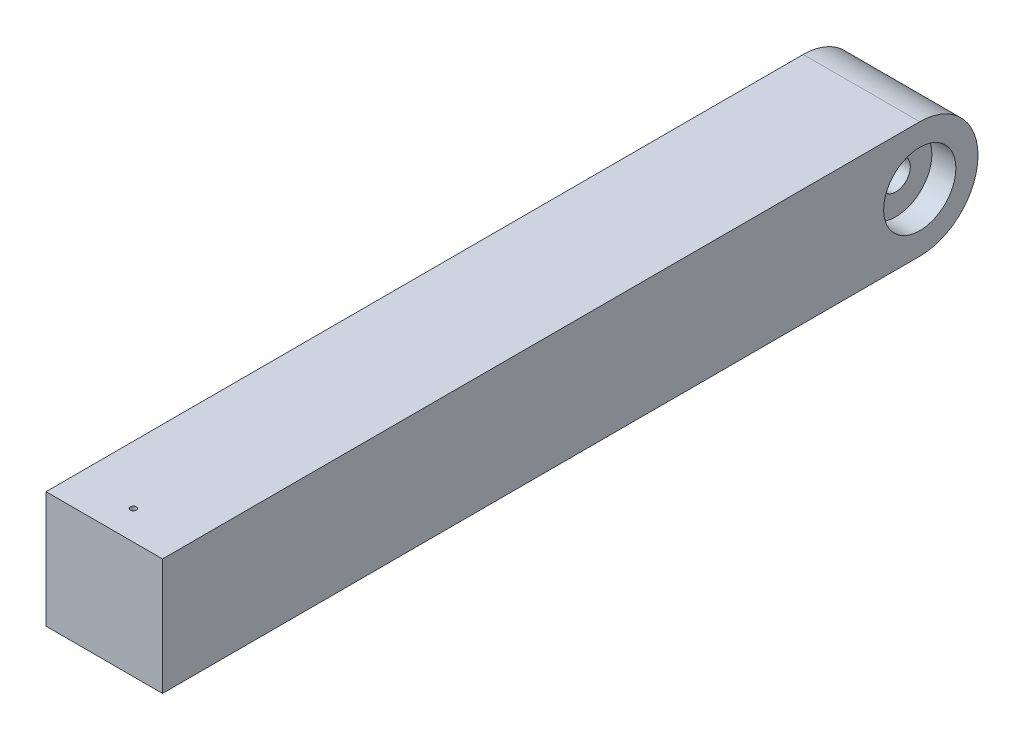
ISO-10303-21;
HEADER;
FILE_DESCRIPTION(('STEP AP214'),'2;1');
FILE_NAME('part.step','',(''),(''),'','','');
FILE_SCHEMA(('AUTOMOTIVE_DESIGN { 1 0 10303 214 1 1 1 1 }'));
ENDSEC;
DATA;
#1=APPLICATION_CONTEXT('core data for automotive mechanical design processes');
#2=APPLICATION_PROTOCOL_DEFINITION('international standard','automotive_design',2000,#1);
#3=PRODUCT_CONTEXT('',#1,'mechanical');
#4=PRODUCT('Part','Part','',(#3));
#5=PRODUCT_RELATED_PRODUCT_CATEGORY('part','',(#4));
#6=PRODUCT_DEFINITION_FORMATION('','',#4);
#7=PRODUCT_DEFINITION_CONTEXT('part definition',#1,'design');
#8=PRODUCT_DEFINITION('design','',#6,#7);
#9=PRODUCT_DEFINITION_SHAPE('','',#8);
#10=(LENGTH_UNIT() NAMED_UNIT(*) SI_UNIT(.MILLI.,.METRE.));
#11=(NAMED_UNIT(*) PLANE_ANGLE_UNIT() SI_UNIT($,.RADIAN.));
#12=(NAMED_UNIT(*) SI_UNIT($,.STERADIAN.) SOLID_ANGLE_UNIT());
#13=UNCERTAINTY_MEASURE_WITH_UNIT(LENGTH_MEASURE(1.E-05),#10,'distance_accuracy_value','');
#14=(GEOMETRIC_REPRESENTATION_CONTEXT(3) GLOBAL_UNCERTAINTY_ASSIGNED_CONTEXT((#13)) GLOBAL_UNIT_ASSIGNED_CONTEXT((#10,
#11,#12)) REPRESENTATION_CONTEXT('',''));
#15=CARTESIAN_POINT('',(0.,0.,0.));
#16=DIRECTION('',(0.,0.,1.));
#17=DIRECTION('',(1.,0.,0.));
#18=AXIS2_PLACEMENT_3D('',#15,#16,#17);
#19=CARTESIAN_POINT('',(-137.681240867132,0.,-650.));
#20=DIRECTION('',(1.,0.,0.));
#21=DIRECTION('',(0.,1.,0.));
#22=AXIS2_PLACEMENT_3D('',#19,#20,#21);
#23=CYLINDRICAL_SURFACE('',#22,31.);
#24=CARTESIAN_POINT('',(-50.,0.,-650.));
#25=DIRECTION('',(-1.,0.,0.));
#26=DIRECTION('',(0.,-1.,0.));
#27=AXIS2_PLACEMENT_3D('',#24,#25,#26);
#28=CIRCLE('',#27,31.);
#29=CARTESIAN_POINT('',(-50.,-31.,-650.));
#30=VERTEX_POINT('',#29);
#31=EDGE_CURVE('E120',#30,#30,#28,.F.);
#32=ORIENTED_EDGE('',*,*,#31,.F.);
#33=EDGE_LOOP('',(#32));
#34=FACE_BOUND('',#33,.T.);
#35=CARTESIAN_POINT('',(-29.4,0.,-650.));
#36=DIRECTION('',(1.,0.,0.));
#37=DIRECTION('',(0.,0.,-1.));
#38=AXIS2_PLACEMENT_3D('',#35,#36,#37);
#39=CIRCLE('',#38,31.);
#40=CARTESIAN_POINT('',(-29.4,0.,-681.));
#41=VERTEX_POINT('',#40);
#42=EDGE_CURVE('E11',#41,#41,#39,.F.);
#43=ORIENTED_EDGE('',*,*,#42,.F.);
#44=EDGE_LOOP('',(#43));
#45=FACE_BOUND('',#44,.T.);
#46=ADVANCED_FACE('F43',(#34,#45),#23,.F.);
#47=CARTESIAN_POINT('',(-50.,-50.,-700.));
#48=DIRECTION('',(0.,-1.,0.));
#49=DIRECTION('',(0.,0.,-1.));
#50=AXIS2_PLACEMENT_3D('',#47,#48,#49);
#51=PLANE('',#50);
#52=CARTESIAN_POINT('',(0.,-50.,-25.));
#53=DIRECTION('',(0.,-1.,0.));
#54=DIRECTION('',(0.,0.,-1.));
#55=AXIS2_PLACEMENT_3D('',#52,#53,#54);
#56=CIRCLE('',#55,2.525);
#57=CARTESIAN_POINT('',(0.,-50.,-27.525));
#58=VERTEX_POINT('',#57);
#59=EDGE_CURVE('E181',#58,#58,#56,.T.);
#60=ORIENTED_EDGE('',*,*,#59,.F.);
#61=EDGE_LOOP('',(#60));
#62=FACE_BOUND('',#61,.T.);
#63=DIRECTION('',(0.,0.,1.));
#64=VECTOR('',#63,1.);
#65=CARTESIAN_POINT('',(-50.,-50.,-700.));
#66=LINE('',#65,#64);
#67=CARTESIAN_POINT('',(-50.,-50.,-650.));
#68=VERTEX_POINT('',#67);
#69=CARTESIAN_POINT('',(-50.,-50.,0.));
#70=VERTEX_POINT('',#69);
#71=EDGE_CURVE('E124',#68,#70,#66,.T.);
#72=ORIENTED_EDGE('',*,*,#71,.F.);
#73=DIRECTION('',(1.,0.,0.));
#74=VECTOR('',#73,1.);
#75=CARTESIAN_POINT('',(50.,-50.,-650.));
#76=LINE('',#75,#74);
#77=CARTESIAN_POINT('',(50.,-50.,-650.));
#78=VERTEX_POINT('',#77);
#79=EDGE_CURVE('E100',#68,#78,#76,.T.);
#80=ORIENTED_EDGE('',*,*,#79,.T.);
#81=DIRECTION('',(0.,0.,1.));
#82=VECTOR('',#81,1.);
#83=CARTESIAN_POINT('',(50.,-50.,-700.));
#84=LINE('',#83,#82);
#85=CARTESIAN_POINT('',(50.,-50.,0.));
#86=VERTEX_POINT('',#85);
#87=EDGE_CURVE('E94',#78,#86,#84,.T.);
#88=ORIENTED_EDGE('',*,*,#87,.T.);
#89=DIRECTION('',(1.,0.,0.));
#90=VECTOR('',#89,1.);
#91=CARTESIAN_POINT('',(-50.,-50.,0.));
#92=LINE('',#91,#90);
#93=EDGE_CURVE('E98',#70,#86,#92,.T.);
#94=ORIENTED_EDGE('',*,*,#93,.F.);
#95=EDGE_LOOP('',(#72,#80,#88,#94));
#96=FACE_BOUND('',#95,.T.);
#97=ADVANCED_FACE('F93',(#62,#96),#51,.T.);
#98=CARTESIAN_POINT('',(-50.,-50.,-700.));
#99=DIRECTION('',(-1.,0.,0.));
#100=DIRECTION('',(0.,-1.,0.));
#101=AXIS2_PLACEMENT_3D('',#98,#99,#100);
#102=PLANE('',#101);
#103=ORIENTED_EDGE('',*,*,#31,.T.);
#104=EDGE_LOOP('',(#103));
#105=FACE_BOUND('',#104,.T.);
#106=CARTESIAN_POINT('',(-50.,0.,-650.));
#107=DIRECTION('',(-1.,0.,0.));
#108=DIRECTION('',(0.,-1.,0.));
#109=AXIS2_PLACEMENT_3D('',#106,#107,#108);
#110=CIRCLE('',#109,50.);
#111=CARTESIAN_POINT('',(-50.,50.,-650.));
#112=VERTEX_POINT('',#111);
#113=CARTESIAN_POINT('',(-50.,0.,-700.));
#114=VERTEX_POINT('',#113);
#115=EDGE_CURVE('E59',#112,#114,#110,.T.);
#116=ORIENTED_EDGE('',*,*,#115,.T.);
#117=CARTESIAN_POINT('',(-50.,0.,-650.));
#118=DIRECTION('',(-1.,0.,0.));
#119=DIRECTION('',(0.,-1.,0.));
#120=AXIS2_PLACEMENT_3D('',#117,#118,#119);
#121=CIRCLE('',#120,50.);
#122=EDGE_CURVE('E133',#114,#68,#121,.T.);
#123=ORIENTED_EDGE('',*,*,#122,.T.);
#124=ORIENTED_EDGE('',*,*,#71,.T.);
#125=DIRECTION('',(0.,-1.,0.));
#126=VECTOR('',#125,1.);
#127=CARTESIAN_POINT('',(-50.,-50.,0.));
#128=LINE('',#127,#126);
#129=CARTESIAN_POINT('',(-50.,50.,0.));
#130=VERTEX_POINT('',#129);
#131=EDGE_CURVE('E105',#130,#70,#128,.T.);
#132=ORIENTED_EDGE('',*,*,#131,.F.);
#133=DIRECTION('',(0.,0.,1.));
#134=VECTOR('',#133,1.);
#135=CARTESIAN_POINT('',(-50.,50.,-700.));
#136=LINE('',#135,#134);
#137=EDGE_CURVE('E123',#112,#130,#136,.T.);
#138=ORIENTED_EDGE('',*,*,#137,.F.);
#139=EDGE_LOOP('',(#116,#123,#124,#132,#138));
#140=FACE_BOUND('',#139,.T.);
#141=ADVANCED_FACE('F136',(#105,#140),#102,.T.);
#142=CARTESIAN_POINT('',(-50.,50.,-700.));
#143=DIRECTION('',(0.,1.,0.));
#144=DIRECTION('',(0.,0.,1.));
#145=AXIS2_PLACEMENT_3D('',#142,#143,#144);
#146=PLANE('',#145);
#147=CARTESIAN_POINT('',(0.,50.,-25.));
#148=DIRECTION('',(0.,1.,0.));
#149=DIRECTION('',(0.,0.,1.));
#150=AXIS2_PLACEMENT_3D('',#147,#148,#149);
#151=CIRCLE('',#150,2.525);
#152=CARTESIAN_POINT('',(0.,50.,-22.475));
#153=VERTEX_POINT('',#152);
#154=EDGE_CURVE('E186',#153,#153,#151,.T.);
#155=ORIENTED_EDGE('',*,*,#154,.F.);
#156=EDGE_LOOP('',(#155));
#157=FACE_BOUND('',#156,.T.);
#158=DIRECTION('',(0.,0.,1.));
#159=VECTOR('',#158,1.);
#160=CARTESIAN_POINT('',(50.,50.,-700.));
#161=LINE('',#160,#159);
#162=CARTESIAN_POINT('',(50.,50.,-650.));
#163=VERTEX_POINT('',#162);
#164=CARTESIAN_POINT('',(50.,50.,0.));
#165=VERTEX_POINT('',#164);
#166=EDGE_CURVE('E103',#163,#165,#161,.T.);
#167=ORIENTED_EDGE('',*,*,#166,.F.);
#168=DIRECTION('',(-1.,0.,0.));
#169=VECTOR('',#168,1.);
#170=CARTESIAN_POINT('',(-50.,50.,-650.));
#171=LINE('',#170,#169);
#172=EDGE_CURVE('E51',#163,#112,#171,.T.);
#173=ORIENTED_EDGE('',*,*,#172,.T.);
#174=ORIENTED_EDGE('',*,*,#137,.T.);
#175=DIRECTION('',(-1.,0.,0.));
#176=VECTOR('',#175,1.);
#177=CARTESIAN_POINT('',(-50.,50.,0.));
#178=LINE('',#177,#176);
#179=EDGE_CURVE('E109',#165,#130,#178,.T.);
#180=ORIENTED_EDGE('',*,*,#179,.F.);
#181=EDGE_LOOP('',(#167,#173,#174,#180));
#182=FACE_BOUND('',#181,.T.);
#183=ADVANCED_FACE('F232',(#157,#182),#146,.T.);
#184=CARTESIAN_POINT('',(50.,-50.,-700.));
#185=DIRECTION('',(1.,0.,0.));
#186=DIRECTION('',(0.,1.,0.));
#187=AXIS2_PLACEMENT_3D('',#184,#185,#186);
#188=PLANE('',#187);
#189=CARTESIAN_POINT('',(50.,0.,-650.));
#190=DIRECTION('',(1.,0.,0.));
#191=DIRECTION('',(0.,1.,0.));
#192=AXIS2_PLACEMENT_3D('',#189,#190,#191);
#193=CIRCLE('',#192,31.);
#194=CARTESIAN_POINT('',(50.,31.,-650.));
#195=VERTEX_POINT('',#194);
#196=EDGE_CURVE('E176',#195,#195,#193,.T.);
#197=ORIENTED_EDGE('',*,*,#196,.F.);
#198=EDGE_LOOP('',(#197));
#199=FACE_BOUND('',#198,.T.);
#200=ORIENTED_EDGE('',*,*,#87,.F.);
#201=CARTESIAN_POINT('',(50.,0.,-650.));
#202=DIRECTION('',(1.,0.,0.));
#203=DIRECTION('',(0.,1.,0.));
#204=AXIS2_PLACEMENT_3D('',#201,#202,#203);
#205=CIRCLE('',#204,50.);
#206=CARTESIAN_POINT('',(50.,0.,-700.));
#207=VERTEX_POINT('',#206);
#208=EDGE_CURVE('E134',#78,#207,#205,.T.);
#209=ORIENTED_EDGE('',*,*,#208,.T.);
#210=CARTESIAN_POINT('',(50.,0.,-650.));
#211=DIRECTION('',(1.,0.,0.));
#212=DIRECTION('',(0.,1.,0.));
#213=AXIS2_PLACEMENT_3D('',#210,#211,#212);
#214=CIRCLE('',#213,50.);
#215=EDGE_CURVE('E128',#207,#163,#214,.T.);
#216=ORIENTED_EDGE('',*,*,#215,.T.);
#217=ORIENTED_EDGE('',*,*,#166,.T.);
#218=DIRECTION('',(0.,1.,0.));
#219=VECTOR('',#218,1.);
#220=CARTESIAN_POINT('',(50.,-50.,0.));
#221=LINE('',#220,#219);
#222=EDGE_CURVE('E102',#86,#165,#221,.T.);
#223=ORIENTED_EDGE('',*,*,#222,.F.);
#224=EDGE_LOOP('',(#200,#209,#216,#217,#223));
#225=FACE_BOUND('',#224,.T.);
#226=ADVANCED_FACE('F106',(#199,#225),#188,.T.);
#227=CARTESIAN_POINT('',(0.,0.,0.));
#228=DIRECTION('',(0.,0.,1.));
#229=DIRECTION('',(1.,0.,0.));
#230=AXIS2_PLACEMENT_3D('',#227,#228,#229);
#231=PLANE('',#230);
#232=ORIENTED_EDGE('',*,*,#93,.T.);
#233=ORIENTED_EDGE('',*,*,#222,.T.);
#234=ORIENTED_EDGE('',*,*,#179,.T.);
#235=ORIENTED_EDGE('',*,*,#131,.T.);
#236=EDGE_LOOP('',(#232,#233,#234,#235));
#237=FACE_BOUND('',#236,.T.);
#238=ADVANCED_FACE('F115',(#237),#231,.T.);
#239=CARTESIAN_POINT('',(-50.,0.,-650.));
#240=DIRECTION('',(1.,0.,0.));
#241=DIRECTION('',(0.,0.,-1.));
#242=AXIS2_PLACEMENT_3D('',#239,#240,#241);
#243=CYLINDRICAL_SURFACE('',#242,50.);
#244=DIRECTION('',(-1.,0.,0.));
#245=VECTOR('',#244,1.);
#246=CARTESIAN_POINT('',(50.,0.,-700.));
#247=LINE('',#246,#245);
#248=EDGE_CURVE('E112',#114,#207,#247,.F.);
#249=ORIENTED_EDGE('',*,*,#248,.F.);
#250=ORIENTED_EDGE('',*,*,#115,.F.);
#251=ORIENTED_EDGE('',*,*,#172,.F.);
#252=ORIENTED_EDGE('',*,*,#215,.F.);
#253=EDGE_LOOP('',(#249,#250,#251,#252));
#254=FACE_BOUND('',#253,.T.);
#255=ADVANCED_FACE('F44',(#254),#243,.T.);
#256=CARTESIAN_POINT('',(-50.,0.,-650.));
#257=DIRECTION('',(-1.,0.,0.));
#258=DIRECTION('',(0.,0.,1.));
#259=AXIS2_PLACEMENT_3D('',#256,#257,#258);
#260=CYLINDRICAL_SURFACE('',#259,50.);
#261=ORIENTED_EDGE('',*,*,#122,.F.);
#262=ORIENTED_EDGE('',*,*,#248,.T.);
#263=ORIENTED_EDGE('',*,*,#208,.F.);
#264=ORIENTED_EDGE('',*,*,#79,.F.);
#265=EDGE_LOOP('',(#261,#262,#263,#264));
#266=FACE_BOUND('',#265,.T.);
#267=ADVANCED_FACE('F138',(#266),#260,.T.);
#268=CARTESIAN_POINT('',(29.4,0.,-650.));
#269=DIRECTION('',(1.,0.,0.));
#270=DIRECTION('',(0.,0.,-1.));
#271=AXIS2_PLACEMENT_3D('',#268,#269,#270);
#272=CIRCLE('',#271,31.);
#273=CARTESIAN_POINT('',(29.4,0.,-681.));
#274=VERTEX_POINT('',#273);
#275=EDGE_CURVE('E173',#274,#274,#272,.T.);
#276=ORIENTED_EDGE('',*,*,#275,.F.);
#277=EDGE_LOOP('',(#276));
#278=FACE_BOUND('',#277,.T.);
#279=ORIENTED_EDGE('',*,*,#196,.T.);
#280=EDGE_LOOP('',(#279));
#281=FACE_BOUND('',#280,.T.);
#282=ADVANCED_FACE('F146',(#278,#281),#23,.F.);
#283=CARTESIAN_POINT('',(0.,-50.,-25.));
#284=DIRECTION('',(0.,-1.,0.));
#285=DIRECTION('',(0.,0.,-1.));
#286=AXIS2_PLACEMENT_3D('',#283,#284,#285);
#287=CYLINDRICAL_SURFACE('',#286,2.49999999999998);
#288=CARTESIAN_POINT('',(0.,49.975,-25.));
#289=DIRECTION('',(0.,1.,0.));
#290=DIRECTION('',(0.,0.,1.));
#291=AXIS2_PLACEMENT_3D('',#288,#289,#290);
#292=CIRCLE('',#291,2.49999999999999);
#293=CARTESIAN_POINT('',(0.,49.975,-22.5));
#294=VERTEX_POINT('',#293);
#295=EDGE_CURVE('E187',#294,#294,#292,.T.);
#296=ORIENTED_EDGE('',*,*,#295,.T.);
#297=EDGE_LOOP('',(#296));
#298=FACE_BOUND('',#297,.T.);
#299=CARTESIAN_POINT('',(0.,-49.975,-25.));
#300=DIRECTION('',(0.,-1.,0.));
#301=DIRECTION('',(0.,0.,-1.));
#302=AXIS2_PLACEMENT_3D('',#299,#300,#301);
#303=CIRCLE('',#302,2.49999999999999);
#304=CARTESIAN_POINT('',(0.,-49.975,-27.5));
#305=VERTEX_POINT('',#304);
#306=EDGE_CURVE('E178',#305,#305,#303,.T.);
#307=ORIENTED_EDGE('',*,*,#306,.T.);
#308=EDGE_LOOP('',(#307));
#309=FACE_BOUND('',#308,.T.);
#310=ADVANCED_FACE('F162',(#298,#309),#287,.F.);
#311=CARTESIAN_POINT('',(0.,-50.,-25.));
#312=DIRECTION('',(0.,-1.,0.));
#313=DIRECTION('',(0.,0.,-1.));
#314=AXIS2_PLACEMENT_3D('',#311,#312,#313);
#315=CONICAL_SURFACE('',#314,2.525,0.785398163397466);
#316=ORIENTED_EDGE('',*,*,#306,.F.);
#317=EDGE_LOOP('',(#316));
#318=FACE_BOUND('',#317,.T.);
#319=ORIENTED_EDGE('',*,*,#59,.T.);
#320=EDGE_LOOP('',(#319));
#321=FACE_BOUND('',#320,.T.);
#322=ADVANCED_FACE('F166',(#318,#321),#315,.F.);
#323=CARTESIAN_POINT('',(0.,50.,-25.));
#324=DIRECTION('',(0.,1.,0.));
#325=DIRECTION('',(0.,0.,1.));
#326=AXIS2_PLACEMENT_3D('',#323,#324,#325);
#327=CONICAL_SURFACE('',#326,2.525,0.785398163397466);
#328=ORIENTED_EDGE('',*,*,#295,.F.);
#329=EDGE_LOOP('',(#328));
#330=FACE_BOUND('',#329,.T.);
#331=ORIENTED_EDGE('',*,*,#154,.T.);
#332=EDGE_LOOP('',(#331));
#333=FACE_BOUND('',#332,.T.);
#334=ADVANCED_FACE('F213',(#330,#333),#327,.F.);
#335=CARTESIAN_POINT('',(-29.4,0.,-650.));
#336=DIRECTION('',(1.,0.,0.));
#337=DIRECTION('',(0.,0.,-1.));
#338=AXIS2_PLACEMENT_3D('',#335,#336,#337);
#339=CYLINDRICAL_SURFACE('',#338,12.5);
#340=CARTESIAN_POINT('',(-29.4,0.,-650.));
#341=DIRECTION('',(1.,0.,0.));
#342=DIRECTION('',(0.,0.,-1.));
#343=AXIS2_PLACEMENT_3D('',#340,#341,#342);
#344=CIRCLE('',#343,12.5);
#345=CARTESIAN_POINT('',(-29.4,0.,-662.5));
#346=VERTEX_POINT('',#345);
#347=EDGE_CURVE('E191',#346,#346,#344,.T.);
#348=ORIENTED_EDGE('',*,*,#347,.F.);
#349=EDGE_LOOP('',(#348));
#350=FACE_BOUND('',#349,.T.);
#351=CARTESIAN_POINT('',(29.4,0.,-650.));
#352=DIRECTION('',(1.,0.,0.));
#353=DIRECTION('',(0.,0.,-1.));
#354=AXIS2_PLACEMENT_3D('',#351,#352,#353);
#355=CIRCLE('',#354,12.5);
#356=CARTESIAN_POINT('',(29.4,0.,-662.5));
#357=VERTEX_POINT('',#356);
#358=EDGE_CURVE('E199',#357,#357,#355,.T.);
#359=ORIENTED_EDGE('',*,*,#358,.T.);
#360=EDGE_LOOP('',(#359));
#361=FACE_BOUND('',#360,.T.);
#362=ADVANCED_FACE('F197',(#350,#361),#339,.F.);
#363=CARTESIAN_POINT('',(-29.4,0.,0.));
#364=DIRECTION('',(1.,0.,0.));
#365=DIRECTION('',(0.,0.,-1.));
#366=AXIS2_PLACEMENT_3D('',#363,#364,#365);
#367=PLANE('',#366);
#368=ORIENTED_EDGE('',*,*,#347,.T.);
#369=EDGE_LOOP('',(#368));
#370=FACE_BOUND('',#369,.T.);
#371=ORIENTED_EDGE('',*,*,#42,.T.);
#372=EDGE_LOOP('',(#371));
#373=FACE_BOUND('',#372,.T.);
#374=ADVANCED_FACE('F202',(#370,#373),#367,.F.);
#375=CARTESIAN_POINT('',(29.4,0.,0.));
#376=DIRECTION('',(1.,0.,0.));
#377=DIRECTION('',(0.,0.,-1.));
#378=AXIS2_PLACEMENT_3D('',#375,#376,#377);
#379=PLANE('',#378);
#380=ORIENTED_EDGE('',*,*,#358,.F.);
#381=EDGE_LOOP('',(#380));
#382=FACE_BOUND('',#381,.T.);
#383=ORIENTED_EDGE('',*,*,#275,.T.);
#384=EDGE_LOOP('',(#383));
#385=FACE_BOUND('',#384,.T.);
#386=ADVANCED_FACE('F201',(#382,#385),#379,.T.);
#387=CLOSED_SHELL('',(#46,#97,#141,#183,#226,#238,#255,#267,#282,#310,#322,#334,#362,#374,#386));
#388=MANIFOLD_SOLID_BREP('B2',#387);
#389=ADVANCED_BREP_SHAPE_REPRESENTATION('',(#18,#388),#14);
#390=SHAPE_DEFINITION_REPRESENTATION(#9,#389);
ENDSEC;
END-ISO-10303-21;
